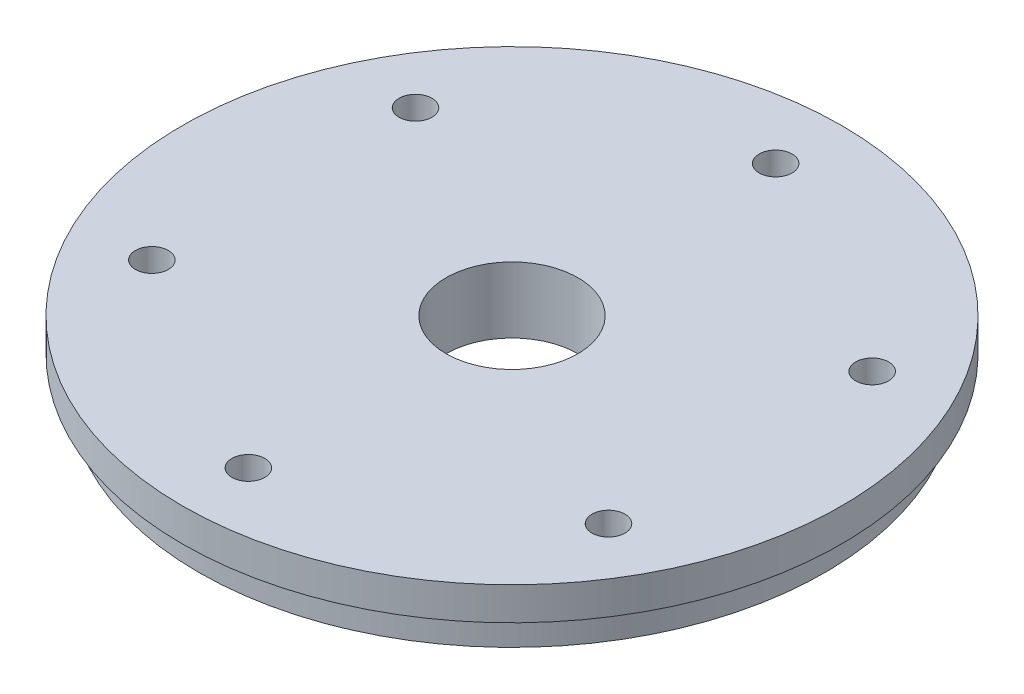
ISO-10303-21;
HEADER;
FILE_DESCRIPTION(('STEP AP214'),'2;1');
FILE_NAME('part.step','',(''),(''),'','','');
FILE_SCHEMA(('AUTOMOTIVE_DESIGN { 1 0 10303 214 1 1 1 1 }'));
ENDSEC;
DATA;
#1=APPLICATION_CONTEXT('core data for automotive mechanical design processes');
#2=APPLICATION_PROTOCOL_DEFINITION('international standard','automotive_design',2000,#1);
#3=PRODUCT_CONTEXT('',#1,'mechanical');
#4=PRODUCT('Part','Part','',(#3));
#5=PRODUCT_RELATED_PRODUCT_CATEGORY('part','',(#4));
#6=PRODUCT_DEFINITION_FORMATION('','',#4);
#7=PRODUCT_DEFINITION_CONTEXT('part definition',#1,'design');
#8=PRODUCT_DEFINITION('design','',#6,#7);
#9=PRODUCT_DEFINITION_SHAPE('','',#8);
#10=(LENGTH_UNIT() NAMED_UNIT(*) SI_UNIT(.MILLI.,.METRE.));
#11=(NAMED_UNIT(*) PLANE_ANGLE_UNIT() SI_UNIT($,.RADIAN.));
#12=(NAMED_UNIT(*) SI_UNIT($,.STERADIAN.) SOLID_ANGLE_UNIT());
#13=UNCERTAINTY_MEASURE_WITH_UNIT(LENGTH_MEASURE(1.E-05),#10,'distance_accuracy_value','');
#14=(GEOMETRIC_REPRESENTATION_CONTEXT(3) GLOBAL_UNCERTAINTY_ASSIGNED_CONTEXT((#13)) GLOBAL_UNIT_ASSIGNED_CONTEXT((#10,
#11,#12)) REPRESENTATION_CONTEXT('',''));
#15=CARTESIAN_POINT('',(0.,0.,0.));
#16=DIRECTION('',(0.,0.,1.));
#17=DIRECTION('',(1.,0.,0.));
#18=AXIS2_PLACEMENT_3D('',#15,#16,#17);
#19=CARTESIAN_POINT('',(0.,3.175,0.));
#20=DIRECTION('',(0.,-1.,0.));
#21=DIRECTION('',(0.,0.,-1.));
#22=AXIS2_PLACEMENT_3D('',#19,#20,#21);
#23=CYLINDRICAL_SURFACE('',#22,30.1625);
#24=CARTESIAN_POINT('',(0.,3.175,0.));
#25=DIRECTION('',(0.,1.,0.));
#26=DIRECTION('',(0.,0.,1.));
#27=AXIS2_PLACEMENT_3D('',#24,#25,#26);
#28=CIRCLE('',#27,30.1625);
#29=CARTESIAN_POINT('',(0.,3.175,30.1625));
#30=VERTEX_POINT('',#29);
#31=EDGE_CURVE('E10',#30,#30,#28,.T.);
#32=ORIENTED_EDGE('',*,*,#31,.F.);
#33=EDGE_LOOP('',(#32));
#34=FACE_BOUND('',#33,.T.);
#35=CARTESIAN_POINT('',(0.,0.,0.));
#36=DIRECTION('',(0.,1.,0.));
#37=DIRECTION('',(0.,0.,1.));
#38=AXIS2_PLACEMENT_3D('',#35,#36,#37);
#39=CIRCLE('',#38,30.1625);
#40=CARTESIAN_POINT('',(0.,0.,30.1625));
#41=VERTEX_POINT('',#40);
#42=EDGE_CURVE('E33',#41,#41,#39,.T.);
#43=ORIENTED_EDGE('',*,*,#42,.T.);
#44=EDGE_LOOP('',(#43));
#45=FACE_BOUND('',#44,.T.);
#46=ADVANCED_FACE('F30',(#34,#45),#23,.T.);
#47=CARTESIAN_POINT('',(0.,0.,0.));
#48=DIRECTION('',(0.,1.,0.));
#49=DIRECTION('',(0.,0.,1.));
#50=AXIS2_PLACEMENT_3D('',#47,#48,#49);
#51=PLANE('',#50);
#52=CARTESIAN_POINT('',(-21.9970452561246,0.,-12.7000000000003));
#53=DIRECTION('',(0.,1.,0.));
#54=DIRECTION('',(0.,0.,1.));
#55=AXIS2_PLACEMENT_3D('',#52,#53,#54);
#56=CIRCLE('',#55,1.5875);
#57=CARTESIAN_POINT('',(-21.9970452561246,0.,-11.1125000000003));
#58=VERTEX_POINT('',#57);
#59=EDGE_CURVE('E81',#58,#58,#56,.T.);
#60=ORIENTED_EDGE('',*,*,#59,.T.);
#61=EDGE_LOOP('',(#60));
#62=FACE_BOUND('',#61,.T.);
#63=CARTESIAN_POINT('',(-21.9970452561242,0.,12.7000000000003));
#64=DIRECTION('',(0.,1.,0.));
#65=DIRECTION('',(0.,0.,1.));
#66=AXIS2_PLACEMENT_3D('',#63,#64,#65);
#67=CIRCLE('',#66,1.58750000000084);
#68=CARTESIAN_POINT('',(-21.9970452561242,0.,14.2875000000012));
#69=VERTEX_POINT('',#68);
#70=EDGE_CURVE('E75',#69,#69,#67,.T.);
#71=ORIENTED_EDGE('',*,*,#70,.T.);
#72=EDGE_LOOP('',(#71));
#73=FACE_BOUND('',#72,.T.);
#74=CARTESIAN_POINT('',(7.15690213792593E-13,0.,25.4));
#75=DIRECTION('',(0.,1.,0.));
#76=DIRECTION('',(0.,0.,1.));
#77=AXIS2_PLACEMENT_3D('',#74,#75,#76);
#78=CIRCLE('',#77,1.58750000000085);
#79=CARTESIAN_POINT('',(7.15690213792593E-13,0.,26.9875000000008));
#80=VERTEX_POINT('',#79);
#81=EDGE_CURVE('E69',#80,#80,#78,.T.);
#82=ORIENTED_EDGE('',*,*,#81,.T.);
#83=EDGE_LOOP('',(#82));
#84=FACE_BOUND('',#83,.T.);
#85=CARTESIAN_POINT('',(21.9970452561253,0.,12.6999999999997));
#86=DIRECTION('',(0.,1.,0.));
#87=DIRECTION('',(0.,0.,1.));
#88=AXIS2_PLACEMENT_3D('',#85,#86,#87);
#89=CIRCLE('',#88,1.58750000000054);
#90=CARTESIAN_POINT('',(21.9970452561253,0.,14.2875000000002));
#91=VERTEX_POINT('',#90);
#92=EDGE_CURVE('E63',#91,#91,#89,.T.);
#93=ORIENTED_EDGE('',*,*,#92,.T.);
#94=EDGE_LOOP('',(#93));
#95=FACE_BOUND('',#94,.T.);
#96=CARTESIAN_POINT('',(21.9970452561248,0.,-12.6999999999999));
#97=DIRECTION('',(0.,1.,0.));
#98=DIRECTION('',(0.,0.,1.));
#99=AXIS2_PLACEMENT_3D('',#96,#97,#98);
#100=CIRCLE('',#99,1.5875);
#101=CARTESIAN_POINT('',(21.9970452561248,0.,-11.1124999999999));
#102=VERTEX_POINT('',#101);
#103=EDGE_CURVE('E57',#102,#102,#100,.T.);
#104=ORIENTED_EDGE('',*,*,#103,.T.);
#105=EDGE_LOOP('',(#104));
#106=FACE_BOUND('',#105,.T.);
#107=CARTESIAN_POINT('',(0.,0.,0.));
#108=DIRECTION('',(0.,1.,0.));
#109=DIRECTION('',(0.,0.,1.));
#110=AXIS2_PLACEMENT_3D('',#107,#108,#109);
#111=CIRCLE('',#110,6.35);
#112=CARTESIAN_POINT('',(0.,0.,6.35));
#113=VERTEX_POINT('',#112);
#114=EDGE_CURVE('E51',#113,#113,#111,.T.);
#115=ORIENTED_EDGE('',*,*,#114,.T.);
#116=EDGE_LOOP('',(#115));
#117=FACE_BOUND('',#116,.T.);
#118=CARTESIAN_POINT('',(0.,0.,-25.4));
#119=DIRECTION('',(0.,1.,0.));
#120=DIRECTION('',(0.,0.,1.));
#121=AXIS2_PLACEMENT_3D('',#118,#119,#120);
#122=CIRCLE('',#121,1.5875);
#123=CARTESIAN_POINT('',(0.,0.,-23.8125));
#124=VERTEX_POINT('',#123);
#125=EDGE_CURVE('E45',#124,#124,#122,.T.);
#126=ORIENTED_EDGE('',*,*,#125,.T.);
#127=EDGE_LOOP('',(#126));
#128=FACE_BOUND('',#127,.T.);
#129=ORIENTED_EDGE('',*,*,#42,.F.);
#130=EDGE_LOOP('',(#129));
#131=FACE_BOUND('',#130,.T.);
#132=ADVANCED_FACE('F90',(#62,#73,#84,#95,#106,#117,#128,#131),#51,.F.);
#133=CARTESIAN_POINT('',(0.,3.175,0.));
#134=DIRECTION('',(0.,1.,0.));
#135=DIRECTION('',(0.,0.,1.));
#136=AXIS2_PLACEMENT_3D('',#133,#134,#135);
#137=PLANE('',#136);
#138=CARTESIAN_POINT('',(0.,3.175,0.));
#139=DIRECTION('',(0.,1.,0.));
#140=DIRECTION('',(0.,0.,1.));
#141=AXIS2_PLACEMENT_3D('',#138,#139,#140);
#142=CIRCLE('',#141,31.75);
#143=CARTESIAN_POINT('',(0.,3.175,31.75));
#144=VERTEX_POINT('',#143);
#145=EDGE_CURVE('E42',#144,#144,#142,.T.);
#146=ORIENTED_EDGE('',*,*,#145,.F.);
#147=EDGE_LOOP('',(#146));
#148=FACE_BOUND('',#147,.T.);
#149=ORIENTED_EDGE('',*,*,#31,.T.);
#150=EDGE_LOOP('',(#149));
#151=FACE_BOUND('',#150,.T.);
#152=ADVANCED_FACE('F122',(#148,#151),#137,.F.);
#153=CARTESIAN_POINT('',(0.,6.35,0.));
#154=DIRECTION('',(0.,-1.,0.));
#155=DIRECTION('',(0.,0.,-1.));
#156=AXIS2_PLACEMENT_3D('',#153,#154,#155);
#157=CYLINDRICAL_SURFACE('',#156,31.75);
#158=CARTESIAN_POINT('',(0.,6.35,0.));
#159=DIRECTION('',(0.,1.,0.));
#160=DIRECTION('',(0.,0.,1.));
#161=AXIS2_PLACEMENT_3D('',#158,#159,#160);
#162=CIRCLE('',#161,31.75);
#163=CARTESIAN_POINT('',(0.,6.35,31.75));
#164=VERTEX_POINT('',#163);
#165=EDGE_CURVE('E40',#164,#164,#162,.T.);
#166=ORIENTED_EDGE('',*,*,#165,.F.);
#167=EDGE_LOOP('',(#166));
#168=FACE_BOUND('',#167,.T.);
#169=ORIENTED_EDGE('',*,*,#145,.T.);
#170=EDGE_LOOP('',(#169));
#171=FACE_BOUND('',#170,.T.);
#172=ADVANCED_FACE('F104',(#168,#171),#157,.T.);
#173=CARTESIAN_POINT('',(0.,6.35,0.));
#174=DIRECTION('',(0.,1.,0.));
#175=DIRECTION('',(0.,0.,1.));
#176=AXIS2_PLACEMENT_3D('',#173,#174,#175);
#177=PLANE('',#176);
#178=CARTESIAN_POINT('',(-21.9970452561246,6.35,-12.7000000000003));
#179=DIRECTION('',(0.,1.,0.));
#180=DIRECTION('',(0.,0.,1.));
#181=AXIS2_PLACEMENT_3D('',#178,#179,#180);
#182=CIRCLE('',#181,1.5875);
#183=CARTESIAN_POINT('',(-21.9970452561246,6.35,-11.1125000000003));
#184=VERTEX_POINT('',#183);
#185=EDGE_CURVE('E84',#184,#184,#182,.T.);
#186=ORIENTED_EDGE('',*,*,#185,.F.);
#187=EDGE_LOOP('',(#186));
#188=FACE_BOUND('',#187,.T.);
#189=CARTESIAN_POINT('',(-21.9970452561242,6.35,12.7000000000003));
#190=DIRECTION('',(0.,1.,0.));
#191=DIRECTION('',(0.,0.,1.));
#192=AXIS2_PLACEMENT_3D('',#189,#190,#191);
#193=CIRCLE('',#192,1.58750000000084);
#194=CARTESIAN_POINT('',(-21.9970452561242,6.35,14.2875000000012));
#195=VERTEX_POINT('',#194);
#196=EDGE_CURVE('E78',#195,#195,#193,.T.);
#197=ORIENTED_EDGE('',*,*,#196,.F.);
#198=EDGE_LOOP('',(#197));
#199=FACE_BOUND('',#198,.T.);
#200=CARTESIAN_POINT('',(7.15690213792593E-13,6.35,25.4));
#201=DIRECTION('',(0.,1.,0.));
#202=DIRECTION('',(0.,0.,1.));
#203=AXIS2_PLACEMENT_3D('',#200,#201,#202);
#204=CIRCLE('',#203,1.58750000000085);
#205=CARTESIAN_POINT('',(7.15690213792593E-13,6.35,26.9875000000008));
#206=VERTEX_POINT('',#205);
#207=EDGE_CURVE('E72',#206,#206,#204,.T.);
#208=ORIENTED_EDGE('',*,*,#207,.F.);
#209=EDGE_LOOP('',(#208));
#210=FACE_BOUND('',#209,.T.);
#211=CARTESIAN_POINT('',(21.9970452561253,6.35,12.6999999999997));
#212=DIRECTION('',(0.,1.,0.));
#213=DIRECTION('',(0.,0.,1.));
#214=AXIS2_PLACEMENT_3D('',#211,#212,#213);
#215=CIRCLE('',#214,1.58750000000054);
#216=CARTESIAN_POINT('',(21.9970452561253,6.35,14.2875000000002));
#217=VERTEX_POINT('',#216);
#218=EDGE_CURVE('E66',#217,#217,#215,.T.);
#219=ORIENTED_EDGE('',*,*,#218,.F.);
#220=EDGE_LOOP('',(#219));
#221=FACE_BOUND('',#220,.T.);
#222=CARTESIAN_POINT('',(21.9970452561248,6.35,-12.6999999999999));
#223=DIRECTION('',(0.,1.,0.));
#224=DIRECTION('',(0.,0.,1.));
#225=AXIS2_PLACEMENT_3D('',#222,#223,#224);
#226=CIRCLE('',#225,1.5875);
#227=CARTESIAN_POINT('',(21.9970452561248,6.35,-11.1124999999999));
#228=VERTEX_POINT('',#227);
#229=EDGE_CURVE('E60',#228,#228,#226,.T.);
#230=ORIENTED_EDGE('',*,*,#229,.F.);
#231=EDGE_LOOP('',(#230));
#232=FACE_BOUND('',#231,.T.);
#233=CARTESIAN_POINT('',(0.,6.35,0.));
#234=DIRECTION('',(0.,1.,0.));
#235=DIRECTION('',(0.,0.,1.));
#236=AXIS2_PLACEMENT_3D('',#233,#234,#235);
#237=CIRCLE('',#236,6.35);
#238=CARTESIAN_POINT('',(0.,6.35,6.35));
#239=VERTEX_POINT('',#238);
#240=EDGE_CURVE('E54',#239,#239,#237,.T.);
#241=ORIENTED_EDGE('',*,*,#240,.F.);
#242=EDGE_LOOP('',(#241));
#243=FACE_BOUND('',#242,.T.);
#244=CARTESIAN_POINT('',(0.,6.35,-25.4));
#245=DIRECTION('',(0.,1.,0.));
#246=DIRECTION('',(0.,0.,1.));
#247=AXIS2_PLACEMENT_3D('',#244,#245,#246);
#248=CIRCLE('',#247,1.5875);
#249=CARTESIAN_POINT('',(0.,6.35,-23.8125));
#250=VERTEX_POINT('',#249);
#251=EDGE_CURVE('E48',#250,#250,#248,.T.);
#252=ORIENTED_EDGE('',*,*,#251,.F.);
#253=EDGE_LOOP('',(#252));
#254=FACE_BOUND('',#253,.T.);
#255=ORIENTED_EDGE('',*,*,#165,.T.);
#256=EDGE_LOOP('',(#255));
#257=FACE_BOUND('',#256,.T.);
#258=ADVANCED_FACE('F100',(#188,#199,#210,#221,#232,#243,#254,#257),#177,.T.);
#259=CARTESIAN_POINT('',(0.,0.,-25.4));
#260=DIRECTION('',(0.,1.,0.));
#261=DIRECTION('',(0.,0.,1.));
#262=AXIS2_PLACEMENT_3D('',#259,#260,#261);
#263=CYLINDRICAL_SURFACE('',#262,1.5875);
#264=ORIENTED_EDGE('',*,*,#125,.F.);
#265=EDGE_LOOP('',(#264));
#266=FACE_BOUND('',#265,.T.);
#267=ORIENTED_EDGE('',*,*,#251,.T.);
#268=EDGE_LOOP('',(#267));
#269=FACE_BOUND('',#268,.T.);
#270=ADVANCED_FACE('F103',(#266,#269),#263,.F.);
#271=CARTESIAN_POINT('',(0.,0.,0.));
#272=DIRECTION('',(0.,1.,0.));
#273=DIRECTION('',(0.,0.,1.));
#274=AXIS2_PLACEMENT_3D('',#271,#272,#273);
#275=CYLINDRICAL_SURFACE('',#274,6.35);
#276=ORIENTED_EDGE('',*,*,#114,.F.);
#277=EDGE_LOOP('',(#276));
#278=FACE_BOUND('',#277,.T.);
#279=ORIENTED_EDGE('',*,*,#240,.T.);
#280=EDGE_LOOP('',(#279));
#281=FACE_BOUND('',#280,.T.);
#282=ADVANCED_FACE('F161',(#278,#281),#275,.F.);
#283=CARTESIAN_POINT('',(21.9970452561248,0.,-12.6999999999999));
#284=DIRECTION('',(0.,1.,0.));
#285=DIRECTION('',(0.,0.,1.));
#286=AXIS2_PLACEMENT_3D('',#283,#284,#285);
#287=CYLINDRICAL_SURFACE('',#286,1.5875);
#288=ORIENTED_EDGE('',*,*,#103,.F.);
#289=EDGE_LOOP('',(#288));
#290=FACE_BOUND('',#289,.T.);
#291=ORIENTED_EDGE('',*,*,#229,.T.);
#292=EDGE_LOOP('',(#291));
#293=FACE_BOUND('',#292,.T.);
#294=ADVANCED_FACE('F171',(#290,#293),#287,.F.);
#295=CARTESIAN_POINT('',(21.9970452561253,0.,12.6999999999997));
#296=DIRECTION('',(0.,1.,0.));
#297=DIRECTION('',(0.,0.,1.));
#298=AXIS2_PLACEMENT_3D('',#295,#296,#297);
#299=CYLINDRICAL_SURFACE('',#298,1.58750000000054);
#300=ORIENTED_EDGE('',*,*,#92,.F.);
#301=EDGE_LOOP('',(#300));
#302=FACE_BOUND('',#301,.T.);
#303=ORIENTED_EDGE('',*,*,#218,.T.);
#304=EDGE_LOOP('',(#303));
#305=FACE_BOUND('',#304,.T.);
#306=ADVANCED_FACE('F181',(#302,#305),#299,.F.);
#307=CARTESIAN_POINT('',(7.15690213792593E-13,0.,25.4));
#308=DIRECTION('',(0.,1.,0.));
#309=DIRECTION('',(0.,0.,1.));
#310=AXIS2_PLACEMENT_3D('',#307,#308,#309);
#311=CYLINDRICAL_SURFACE('',#310,1.58750000000085);
#312=ORIENTED_EDGE('',*,*,#81,.F.);
#313=EDGE_LOOP('',(#312));
#314=FACE_BOUND('',#313,.T.);
#315=ORIENTED_EDGE('',*,*,#207,.T.);
#316=EDGE_LOOP('',(#315));
#317=FACE_BOUND('',#316,.T.);
#318=ADVANCED_FACE('F191',(#314,#317),#311,.F.);
#319=CARTESIAN_POINT('',(-21.9970452561242,0.,12.7000000000003));
#320=DIRECTION('',(0.,1.,0.));
#321=DIRECTION('',(0.,0.,1.));
#322=AXIS2_PLACEMENT_3D('',#319,#320,#321);
#323=CYLINDRICAL_SURFACE('',#322,1.58750000000084);
#324=ORIENTED_EDGE('',*,*,#70,.F.);
#325=EDGE_LOOP('',(#324));
#326=FACE_BOUND('',#325,.T.);
#327=ORIENTED_EDGE('',*,*,#196,.T.);
#328=EDGE_LOOP('',(#327));
#329=FACE_BOUND('',#328,.T.);
#330=ADVANCED_FACE('F96',(#326,#329),#323,.F.);
#331=CARTESIAN_POINT('',(-21.9970452561246,0.,-12.7000000000003));
#332=DIRECTION('',(0.,1.,0.));
#333=DIRECTION('',(0.,0.,1.));
#334=AXIS2_PLACEMENT_3D('',#331,#332,#333);
#335=CYLINDRICAL_SURFACE('',#334,1.5875);
#336=ORIENTED_EDGE('',*,*,#59,.F.);
#337=EDGE_LOOP('',(#336));
#338=FACE_BOUND('',#337,.T.);
#339=ORIENTED_EDGE('',*,*,#185,.T.);
#340=EDGE_LOOP('',(#339));
#341=FACE_BOUND('',#340,.T.);
#342=ADVANCED_FACE('F93',(#338,#341),#335,.F.);
#343=CLOSED_SHELL('',(#46,#132,#152,#172,#258,#270,#282,#294,#306,#318,#330,#342));
#344=MANIFOLD_SOLID_BREP('B2',#343);
#345=ADVANCED_BREP_SHAPE_REPRESENTATION('',(#18,#344),#14);
#346=SHAPE_DEFINITION_REPRESENTATION(#9,#345);
ENDSEC;
END-ISO-10303-21;
